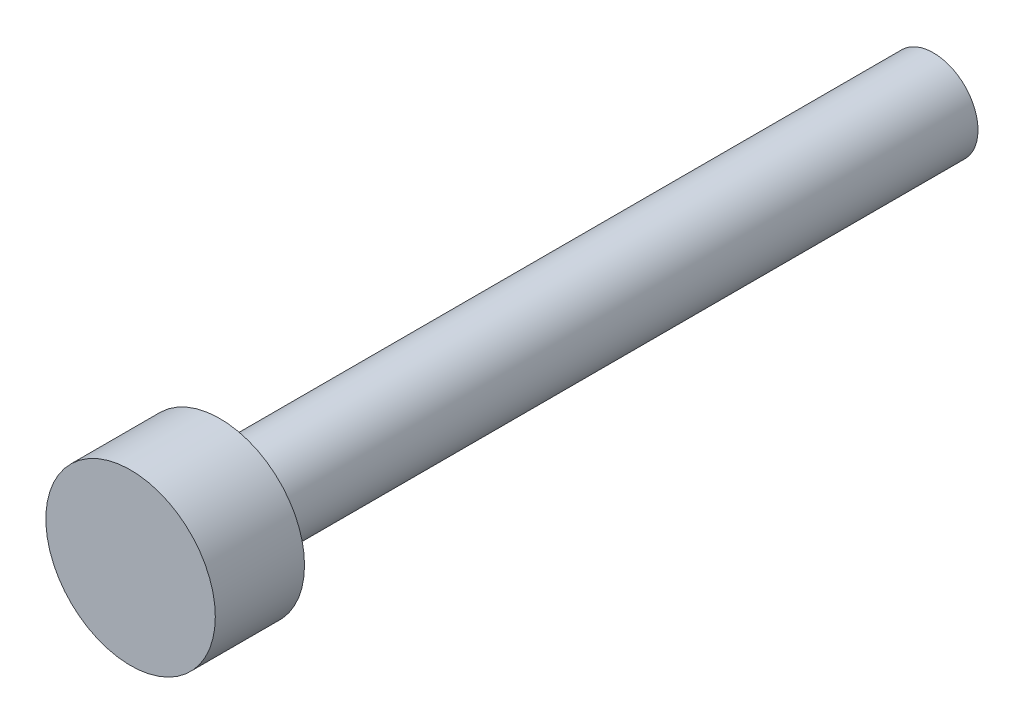
ISO-10303-21;
HEADER;
FILE_DESCRIPTION(('STEP AP214'),'2;1');
FILE_NAME('part.step','',(''),(''),'','','');
FILE_SCHEMA(('AUTOMOTIVE_DESIGN { 1 0 10303 214 1 1 1 1 }'));
ENDSEC;
DATA;
#1=APPLICATION_CONTEXT('core data for automotive mechanical design processes');
#2=APPLICATION_PROTOCOL_DEFINITION('international standard','automotive_design',2000,#1);
#3=PRODUCT_CONTEXT('',#1,'mechanical');
#4=PRODUCT('Part','Part','',(#3));
#5=PRODUCT_RELATED_PRODUCT_CATEGORY('part','',(#4));
#6=PRODUCT_DEFINITION_FORMATION('','',#4);
#7=PRODUCT_DEFINITION_CONTEXT('part definition',#1,'design');
#8=PRODUCT_DEFINITION('design','',#6,#7);
#9=PRODUCT_DEFINITION_SHAPE('','',#8);
#10=(LENGTH_UNIT() NAMED_UNIT(*) SI_UNIT(.MILLI.,.METRE.));
#11=(NAMED_UNIT(*) PLANE_ANGLE_UNIT() SI_UNIT($,.RADIAN.));
#12=(NAMED_UNIT(*) SI_UNIT($,.STERADIAN.) SOLID_ANGLE_UNIT());
#13=UNCERTAINTY_MEASURE_WITH_UNIT(LENGTH_MEASURE(1.E-05),#10,'distance_accuracy_value','');
#14=(GEOMETRIC_REPRESENTATION_CONTEXT(3) GLOBAL_UNCERTAINTY_ASSIGNED_CONTEXT((#13)) GLOBAL_UNIT_ASSIGNED_CONTEXT((#10,
#11,#12)) REPRESENTATION_CONTEXT('',''));
#15=CARTESIAN_POINT('',(0.,0.,0.));
#16=DIRECTION('',(0.,0.,1.));
#17=DIRECTION('',(1.,0.,0.));
#18=AXIS2_PLACEMENT_3D('',#15,#16,#17);
#19=CARTESIAN_POINT('',(0.,0.,0.));
#20=DIRECTION('',(0.,0.,-1.));
#21=DIRECTION('',(-1.,0.,0.));
#22=AXIS2_PLACEMENT_3D('',#19,#20,#21);
#23=CYLINDRICAL_SURFACE('',#22,1.);
#24=CARTESIAN_POINT('',(0.,0.,0.));
#25=DIRECTION('',(0.,0.,1.));
#26=DIRECTION('',(1.,0.,0.));
#27=AXIS2_PLACEMENT_3D('',#24,#25,#26);
#28=CIRCLE('',#27,1.);
#29=CARTESIAN_POINT('',(1.,0.,0.));
#30=VERTEX_POINT('',#29);
#31=EDGE_CURVE('E10',#30,#30,#28,.T.);
#32=ORIENTED_EDGE('',*,*,#31,.F.);
#33=EDGE_LOOP('',(#32));
#34=FACE_BOUND('',#33,.T.);
#35=CARTESIAN_POINT('',(0.,0.,-16.));
#36=DIRECTION('',(0.,0.,1.));
#37=DIRECTION('',(1.,0.,0.));
#38=AXIS2_PLACEMENT_3D('',#35,#36,#37);
#39=CIRCLE('',#38,1.);
#40=CARTESIAN_POINT('',(1.,0.,-16.));
#41=VERTEX_POINT('',#40);
#42=EDGE_CURVE('E44',#41,#41,#39,.T.);
#43=ORIENTED_EDGE('',*,*,#42,.T.);
#44=EDGE_LOOP('',(#43));
#45=FACE_BOUND('',#44,.T.);
#46=ADVANCED_FACE('F41',(#34,#45),#23,.T.);
#47=CARTESIAN_POINT('',(0.,0.,-16.));
#48=DIRECTION('',(0.,0.,1.));
#49=DIRECTION('',(1.,0.,0.));
#50=AXIS2_PLACEMENT_3D('',#47,#48,#49);
#51=PLANE('',#50);
#52=ORIENTED_EDGE('',*,*,#42,.F.);
#53=EDGE_LOOP('',(#52));
#54=FACE_BOUND('',#53,.T.);
#55=ADVANCED_FACE('F64',(#54),#51,.F.);
#56=CARTESIAN_POINT('',(0.,0.,2.));
#57=DIRECTION('',(0.,0.,-1.));
#58=DIRECTION('',(-1.,0.,0.));
#59=AXIS2_PLACEMENT_3D('',#56,#57,#58);
#60=CYLINDRICAL_SURFACE('',#59,1.9);
#61=CARTESIAN_POINT('',(0.,0.,2.));
#62=DIRECTION('',(0.,0.,1.));
#63=DIRECTION('',(1.,0.,0.));
#64=AXIS2_PLACEMENT_3D('',#61,#62,#63);
#65=CIRCLE('',#64,1.9);
#66=CARTESIAN_POINT('',(1.9,0.,2.));
#67=VERTEX_POINT('',#66);
#68=EDGE_CURVE('E51',#67,#67,#65,.T.);
#69=ORIENTED_EDGE('',*,*,#68,.F.);
#70=EDGE_LOOP('',(#69));
#71=FACE_BOUND('',#70,.T.);
#72=CARTESIAN_POINT('',(0.,0.,0.));
#73=DIRECTION('',(0.,0.,1.));
#74=DIRECTION('',(1.,0.,0.));
#75=AXIS2_PLACEMENT_3D('',#72,#73,#74);
#76=CIRCLE('',#75,1.9);
#77=CARTESIAN_POINT('',(1.9,0.,0.));
#78=VERTEX_POINT('',#77);
#79=EDGE_CURVE('E53',#78,#78,#76,.T.);
#80=ORIENTED_EDGE('',*,*,#79,.T.);
#81=EDGE_LOOP('',(#80));
#82=FACE_BOUND('',#81,.T.);
#83=ADVANCED_FACE('F61',(#71,#82),#60,.T.);
#84=CARTESIAN_POINT('',(0.,0.,2.));
#85=DIRECTION('',(0.,0.,1.));
#86=DIRECTION('',(1.,0.,0.));
#87=AXIS2_PLACEMENT_3D('',#84,#85,#86);
#88=PLANE('',#87);
#89=ORIENTED_EDGE('',*,*,#68,.T.);
#90=EDGE_LOOP('',(#89));
#91=FACE_BOUND('',#90,.T.);
#92=ADVANCED_FACE('F59',(#91),#88,.T.);
#93=CARTESIAN_POINT('',(0.,0.,0.));
#94=DIRECTION('',(0.,0.,1.));
#95=DIRECTION('',(1.,0.,0.));
#96=AXIS2_PLACEMENT_3D('',#93,#94,#95);
#97=PLANE('',#96);
#98=ORIENTED_EDGE('',*,*,#31,.T.);
#99=EDGE_LOOP('',(#98));
#100=FACE_BOUND('',#99,.T.);
#101=ORIENTED_EDGE('',*,*,#79,.F.);
#102=EDGE_LOOP('',(#101));
#103=FACE_BOUND('',#102,.T.);
#104=ADVANCED_FACE('F68',(#100,#103),#97,.F.);
#105=CLOSED_SHELL('',(#46,#55,#83,#92,#104));
#106=MANIFOLD_SOLID_BREP('B2',#105);
#107=ADVANCED_BREP_SHAPE_REPRESENTATION('',(#18,#106),#14);
#108=SHAPE_DEFINITION_REPRESENTATION(#9,#107);
ENDSEC;
END-ISO-10303-21;
